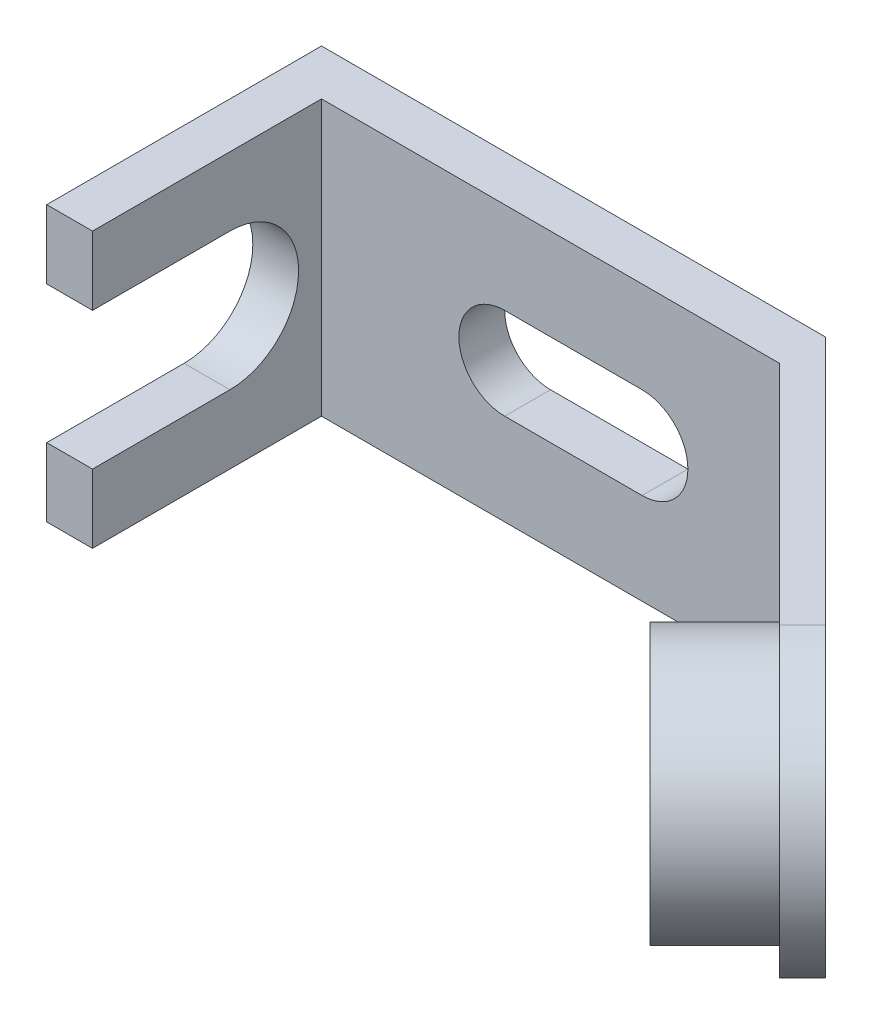
ISO-10303-21;
HEADER;
FILE_DESCRIPTION(('STEP AP214'),'2;1');
FILE_NAME('part.step','',(''),(''),'','','');
FILE_SCHEMA(('AUTOMOTIVE_DESIGN { 1 0 10303 214 1 1 1 1 }'));
ENDSEC;
DATA;
#1=APPLICATION_CONTEXT('core data for automotive mechanical design processes');
#2=APPLICATION_PROTOCOL_DEFINITION('international standard','automotive_design',2000,#1);
#3=PRODUCT_CONTEXT('',#1,'mechanical');
#4=PRODUCT('Part','Part','',(#3));
#5=PRODUCT_RELATED_PRODUCT_CATEGORY('part','',(#4));
#6=PRODUCT_DEFINITION_FORMATION('','',#4);
#7=PRODUCT_DEFINITION_CONTEXT('part definition',#1,'design');
#8=PRODUCT_DEFINITION('design','',#6,#7);
#9=PRODUCT_DEFINITION_SHAPE('','',#8);
#10=(LENGTH_UNIT() NAMED_UNIT(*) SI_UNIT(.MILLI.,.METRE.));
#11=(NAMED_UNIT(*) PLANE_ANGLE_UNIT() SI_UNIT($,.RADIAN.));
#12=(NAMED_UNIT(*) SI_UNIT($,.STERADIAN.) SOLID_ANGLE_UNIT());
#13=UNCERTAINTY_MEASURE_WITH_UNIT(LENGTH_MEASURE(1.E-05),#10,'distance_accuracy_value','');
#14=(GEOMETRIC_REPRESENTATION_CONTEXT(3) GLOBAL_UNCERTAINTY_ASSIGNED_CONTEXT((#13)) GLOBAL_UNIT_ASSIGNED_CONTEXT((#10,
#11,#12)) REPRESENTATION_CONTEXT('',''));
#15=CARTESIAN_POINT('',(0.,0.,0.));
#16=DIRECTION('',(0.,0.,1.));
#17=DIRECTION('',(1.,0.,0.));
#18=AXIS2_PLACEMENT_3D('',#15,#16,#17);
#19=CARTESIAN_POINT('',(-50.,-30.,10.));
#20=DIRECTION('',(0.,1.,0.));
#21=DIRECTION('',(0.,0.,1.));
#22=AXIS2_PLACEMENT_3D('',#19,#20,#21);
#23=PLANE('',#22);
#24=DIRECTION('',(-0.707106781186549,0.,0.707106781186546));
#25=VECTOR('',#24,1.);
#26=CARTESIAN_POINT('',(113.639610306789,-30.,45.3553390593275));
#27=LINE('',#26,#25);
#28=CARTESIAN_POINT('',(104.497474683058,-30.,54.4974746830584));
#29=VERTEX_POINT('',#28);
#30=CARTESIAN_POINT('',(99.4974746830583,-30.,59.4974746830584));
#31=VERTEX_POINT('',#30);
#32=EDGE_CURVE('E49',#29,#31,#27,.T.);
#33=ORIENTED_EDGE('',*,*,#32,.T.);
#34=DIRECTION('',(-0.707106781186546,0.,-0.707106781186549));
#35=VECTOR('',#34,1.);
#36=CARTESIAN_POINT('',(50.,-30.,10.));
#37=LINE('',#36,#35);
#38=CARTESIAN_POINT('',(50.,-30.,10.));
#39=VERTEX_POINT('',#38);
#40=EDGE_CURVE('E159',#31,#39,#37,.T.);
#41=ORIENTED_EDGE('',*,*,#40,.T.);
#42=DIRECTION('',(1.,0.,0.));
#43=VECTOR('',#42,1.);
#44=CARTESIAN_POINT('',(-50.,-30.,10.));
#45=LINE('',#44,#43);
#46=CARTESIAN_POINT('',(-50.,-30.,10.));
#47=VERTEX_POINT('',#46);
#48=EDGE_CURVE('E43',#47,#39,#45,.T.);
#49=ORIENTED_EDGE('',*,*,#48,.F.);
#50=DIRECTION('',(0.,0.,1.));
#51=VECTOR('',#50,1.);
#52=CARTESIAN_POINT('',(-50.,-30.,0.));
#53=LINE('',#52,#51);
#54=CARTESIAN_POINT('',(-50.,-30.,60.));
#55=VERTEX_POINT('',#54);
#56=EDGE_CURVE('E167',#47,#55,#53,.T.);
#57=ORIENTED_EDGE('',*,*,#56,.T.);
#58=DIRECTION('',(1.,0.,0.));
#59=VECTOR('',#58,1.);
#60=CARTESIAN_POINT('',(-60.,-30.,60.));
#61=LINE('',#60,#59);
#62=CARTESIAN_POINT('',(-60.,-30.,60.));
#63=VERTEX_POINT('',#62);
#64=EDGE_CURVE('E224',#63,#55,#61,.T.);
#65=ORIENTED_EDGE('',*,*,#64,.F.);
#66=DIRECTION('',(0.,0.,1.));
#67=VECTOR('',#66,1.);
#68=CARTESIAN_POINT('',(-60.,-30.,0.));
#69=LINE('',#68,#67);
#70=CARTESIAN_POINT('',(-60.,-30.,0.));
#71=VERTEX_POINT('',#70);
#72=EDGE_CURVE('E181',#71,#63,#69,.T.);
#73=ORIENTED_EDGE('',*,*,#72,.F.);
#74=DIRECTION('',(1.,0.,0.));
#75=VECTOR('',#74,1.);
#76=CARTESIAN_POINT('',(-50.,-30.,0.));
#77=LINE('',#76,#75);
#78=CARTESIAN_POINT('',(50.,-30.,0.));
#79=VERTEX_POINT('',#78);
#80=EDGE_CURVE('E259',#71,#79,#77,.T.);
#81=ORIENTED_EDGE('',*,*,#80,.T.);
#82=DIRECTION('',(0.707106781186546,0.,0.707106781186549));
#83=VECTOR('',#82,1.);
#84=CARTESIAN_POINT('',(50.,-30.,0.));
#85=LINE('',#84,#83);
#86=EDGE_CURVE('E169',#79,#29,#85,.T.);
#87=ORIENTED_EDGE('',*,*,#86,.T.);
#88=EDGE_LOOP('',(#33,#41,#49,#57,#65,#73,#81,#87));
#89=FACE_BOUND('',#88,.T.);
#90=ADVANCED_FACE('F34',(#89),#23,.F.);
#91=CARTESIAN_POINT('',(50.,146.726175299287,10.));
#92=DIRECTION('',(-0.707106781186549,0.,0.707106781186546));
#93=DIRECTION('',(0.707106781186546,0.,0.707106781186549));
#94=AXIS2_PLACEMENT_3D('',#91,#92,#93);
#95=PLANE('',#94);
#96=CARTESIAN_POINT('',(99.4974746830583,0.,59.4974746830584));
#97=DIRECTION('',(-0.707106781186549,0.,0.707106781186546));
#98=DIRECTION('',(0.707106781186546,0.,0.707106781186549));
#99=AXIS2_PLACEMENT_3D('',#96,#97,#98);
#100=CIRCLE('',#99,25.);
#101=CARTESIAN_POINT('',(117.175144212722,0.,77.1751442127222));
#102=VERTEX_POINT('',#101);
#103=EDGE_CURVE('E173',#102,#102,#100,.T.);
#104=ORIENTED_EDGE('',*,*,#103,.F.);
#105=EDGE_LOOP('',(#104));
#106=FACE_BOUND('',#105,.T.);
#107=CARTESIAN_POINT('',(99.4974746830583,0.,59.4974746830584));
#108=DIRECTION('',(-0.707106781186549,0.,0.707106781186546));
#109=DIRECTION('',(0.707106781186546,0.,0.707106781186549));
#110=AXIS2_PLACEMENT_3D('',#107,#108,#109);
#111=CIRCLE('',#110,30.);
#112=CARTESIAN_POINT('',(99.4974746830583,30.,59.4974746830584));
#113=VERTEX_POINT('',#112);
#114=EDGE_CURVE('E148',#113,#31,#111,.F.);
#115=ORIENTED_EDGE('',*,*,#114,.F.);
#116=DIRECTION('',(0.707106781186546,0.,0.707106781186549));
#117=VECTOR('',#116,1.);
#118=CARTESIAN_POINT('',(50.,30.,10.));
#119=LINE('',#118,#117);
#120=CARTESIAN_POINT('',(50.,30.,10.));
#121=VERTEX_POINT('',#120);
#122=EDGE_CURVE('E158',#121,#113,#119,.T.);
#123=ORIENTED_EDGE('',*,*,#122,.F.);
#124=DIRECTION('',(0.,1.,0.));
#125=VECTOR('',#124,1.);
#126=CARTESIAN_POINT('',(50.,-30.,10.));
#127=LINE('',#126,#125);
#128=EDGE_CURVE('E257',#39,#121,#127,.T.);
#129=ORIENTED_EDGE('',*,*,#128,.F.);
#130=ORIENTED_EDGE('',*,*,#40,.F.);
#131=EDGE_LOOP('',(#115,#123,#129,#130));
#132=FACE_BOUND('',#131,.T.);
#133=ADVANCED_FACE('F156',(#106,#132),#95,.T.);
#134=CARTESIAN_POINT('',(50.,146.726175299287,0.));
#135=DIRECTION('',(0.707106781186549,0.,-0.707106781186546));
#136=DIRECTION('',(-0.707106781186546,0.,-0.707106781186549));
#137=AXIS2_PLACEMENT_3D('',#134,#135,#136);
#138=PLANE('',#137);
#139=CARTESIAN_POINT('',(104.497474683058,0.,54.4974746830584));
#140=DIRECTION('',(0.707106781186549,0.,-0.707106781186546));
#141=DIRECTION('',(-0.707106781186546,0.,-0.707106781186549));
#142=AXIS2_PLACEMENT_3D('',#139,#140,#141);
#143=CIRCLE('',#142,15.);
#144=CARTESIAN_POINT('',(93.89087296526,0.,43.8908729652602));
#145=VERTEX_POINT('',#144);
#146=EDGE_CURVE('E38',#145,#145,#143,.T.);
#147=ORIENTED_EDGE('',*,*,#146,.F.);
#148=EDGE_LOOP('',(#147));
#149=FACE_BOUND('',#148,.T.);
#150=CARTESIAN_POINT('',(104.497474683058,0.,54.4974746830584));
#151=DIRECTION('',(0.707106781186549,0.,-0.707106781186546));
#152=DIRECTION('',(-0.707106781186546,0.,-0.707106781186549));
#153=AXIS2_PLACEMENT_3D('',#150,#151,#152);
#154=CIRCLE('',#153,30.);
#155=CARTESIAN_POINT('',(104.497474683058,30.,54.4974746830585));
#156=VERTEX_POINT('',#155);
#157=EDGE_CURVE('E11',#29,#156,#154,.F.);
#158=ORIENTED_EDGE('',*,*,#157,.F.);
#159=ORIENTED_EDGE('',*,*,#86,.F.);
#160=DIRECTION('',(0.,1.,0.));
#161=VECTOR('',#160,1.);
#162=CARTESIAN_POINT('',(50.,-30.,0.));
#163=LINE('',#162,#161);
#164=CARTESIAN_POINT('',(50.,30.,0.));
#165=VERTEX_POINT('',#164);
#166=EDGE_CURVE('E256',#79,#165,#163,.T.);
#167=ORIENTED_EDGE('',*,*,#166,.T.);
#168=DIRECTION('',(-0.707106781186546,0.,-0.707106781186549));
#169=VECTOR('',#168,1.);
#170=CARTESIAN_POINT('',(50.,30.,0.));
#171=LINE('',#170,#169);
#172=EDGE_CURVE('E165',#156,#165,#171,.T.);
#173=ORIENTED_EDGE('',*,*,#172,.F.);
#174=EDGE_LOOP('',(#158,#159,#167,#173));
#175=FACE_BOUND('',#174,.T.);
#176=ADVANCED_FACE('F278',(#149,#175),#138,.T.);
#177=CARTESIAN_POINT('',(0.,0.,10.));
#178=DIRECTION('',(0.,0.,-1.));
#179=DIRECTION('',(-1.,0.,0.));
#180=AXIS2_PLACEMENT_3D('',#177,#178,#179);
#181=PLANE('',#180);
#182=ORIENTED_EDGE('',*,*,#128,.T.);
#183=DIRECTION('',(-1.,0.,0.));
#184=VECTOR('',#183,1.);
#185=CARTESIAN_POINT('',(-50.,30.,10.));
#186=LINE('',#185,#184);
#187=CARTESIAN_POINT('',(-50.,30.,10.));
#188=VERTEX_POINT('',#187);
#189=EDGE_CURVE('E163',#121,#188,#186,.T.);
#190=ORIENTED_EDGE('',*,*,#189,.T.);
#191=DIRECTION('',(0.,-1.,0.));
#192=VECTOR('',#191,1.);
#193=CARTESIAN_POINT('',(-50.,-30.,10.));
#194=LINE('',#193,#192);
#195=EDGE_CURVE('E261',#188,#47,#194,.T.);
#196=ORIENTED_EDGE('',*,*,#195,.T.);
#197=ORIENTED_EDGE('',*,*,#48,.T.);
#198=EDGE_LOOP('',(#182,#190,#196,#197));
#199=FACE_BOUND('',#198,.T.);
#200=CARTESIAN_POINT('',(-9.99999999999999,0.,10.));
#201=DIRECTION('',(0.,0.,1.));
#202=DIRECTION('',(1.,0.,0.));
#203=AXIS2_PLACEMENT_3D('',#200,#201,#202);
#204=CIRCLE('',#203,10.);
#205=CARTESIAN_POINT('',(-9.99999999999999,10.,10.));
#206=VERTEX_POINT('',#205);
#207=CARTESIAN_POINT('',(-9.99999999999999,-10.,10.));
#208=VERTEX_POINT('',#207);
#209=EDGE_CURVE('E228',#206,#208,#204,.T.);
#210=ORIENTED_EDGE('',*,*,#209,.F.);
#211=DIRECTION('',(-1.,0.,0.));
#212=VECTOR('',#211,1.);
#213=CARTESIAN_POINT('',(-9.99999999999999,10.,10.));
#214=LINE('',#213,#212);
#215=CARTESIAN_POINT('',(20.,10.,10.));
#216=VERTEX_POINT('',#215);
#217=EDGE_CURVE('E235',#216,#206,#214,.T.);
#218=ORIENTED_EDGE('',*,*,#217,.F.);
#219=CARTESIAN_POINT('',(20.,0.,10.));
#220=DIRECTION('',(0.,0.,1.));
#221=DIRECTION('',(1.,0.,0.));
#222=AXIS2_PLACEMENT_3D('',#219,#220,#221);
#223=CIRCLE('',#222,10.);
#224=CARTESIAN_POINT('',(20.,-10.,10.));
#225=VERTEX_POINT('',#224);
#226=EDGE_CURVE('E233',#225,#216,#223,.T.);
#227=ORIENTED_EDGE('',*,*,#226,.F.);
#228=DIRECTION('',(1.,0.,0.));
#229=VECTOR('',#228,1.);
#230=CARTESIAN_POINT('',(-9.99999999999999,-10.,10.));
#231=LINE('',#230,#229);
#232=EDGE_CURVE('E230',#208,#225,#231,.T.);
#233=ORIENTED_EDGE('',*,*,#232,.F.);
#234=EDGE_LOOP('',(#210,#218,#227,#233));
#235=FACE_BOUND('',#234,.T.);
#236=ADVANCED_FACE('F296',(#199,#235),#181,.F.);
#237=CARTESIAN_POINT('',(0.,0.,0.));
#238=DIRECTION('',(0.,0.,-1.));
#239=DIRECTION('',(-1.,0.,0.));
#240=AXIS2_PLACEMENT_3D('',#237,#238,#239);
#241=PLANE('',#240);
#242=ORIENTED_EDGE('',*,*,#166,.F.);
#243=ORIENTED_EDGE('',*,*,#80,.F.);
#244=DIRECTION('',(0.,-1.,0.));
#245=VECTOR('',#244,1.);
#246=CARTESIAN_POINT('',(-60.,30.,0.));
#247=LINE('',#246,#245);
#248=CARTESIAN_POINT('',(-60.,30.,0.));
#249=VERTEX_POINT('',#248);
#250=EDGE_CURVE('E178',#249,#71,#247,.T.);
#251=ORIENTED_EDGE('',*,*,#250,.F.);
#252=DIRECTION('',(-1.,0.,0.));
#253=VECTOR('',#252,1.);
#254=CARTESIAN_POINT('',(-50.,30.,0.));
#255=LINE('',#254,#253);
#256=EDGE_CURVE('E268',#165,#249,#255,.T.);
#257=ORIENTED_EDGE('',*,*,#256,.F.);
#258=EDGE_LOOP('',(#242,#243,#251,#257));
#259=FACE_BOUND('',#258,.T.);
#260=DIRECTION('',(-1.,0.,0.));
#261=VECTOR('',#260,1.);
#262=CARTESIAN_POINT('',(-9.99999999999999,10.,0.));
#263=LINE('',#262,#261);
#264=CARTESIAN_POINT('',(20.,10.,0.));
#265=VERTEX_POINT('',#264);
#266=CARTESIAN_POINT('',(-9.99999999999999,10.,0.));
#267=VERTEX_POINT('',#266);
#268=EDGE_CURVE('E231',#265,#267,#263,.T.);
#269=ORIENTED_EDGE('',*,*,#268,.T.);
#270=CARTESIAN_POINT('',(-9.99999999999999,0.,0.));
#271=DIRECTION('',(0.,0.,1.));
#272=DIRECTION('',(1.,0.,0.));
#273=AXIS2_PLACEMENT_3D('',#270,#271,#272);
#274=CIRCLE('',#273,10.);
#275=CARTESIAN_POINT('',(-9.99999999999999,-10.,0.));
#276=VERTEX_POINT('',#275);
#277=EDGE_CURVE('E227',#267,#276,#274,.T.);
#278=ORIENTED_EDGE('',*,*,#277,.T.);
#279=DIRECTION('',(1.,0.,0.));
#280=VECTOR('',#279,1.);
#281=CARTESIAN_POINT('',(-9.99999999999999,-10.,0.));
#282=LINE('',#281,#280);
#283=CARTESIAN_POINT('',(20.,-10.,0.));
#284=VERTEX_POINT('',#283);
#285=EDGE_CURVE('E240',#276,#284,#282,.T.);
#286=ORIENTED_EDGE('',*,*,#285,.T.);
#287=CARTESIAN_POINT('',(20.,0.,0.));
#288=DIRECTION('',(0.,0.,1.));
#289=DIRECTION('',(1.,0.,0.));
#290=AXIS2_PLACEMENT_3D('',#287,#288,#289);
#291=CIRCLE('',#290,10.);
#292=EDGE_CURVE('E243',#284,#265,#291,.T.);
#293=ORIENTED_EDGE('',*,*,#292,.T.);
#294=EDGE_LOOP('',(#269,#278,#286,#293));
#295=FACE_BOUND('',#294,.T.);
#296=ADVANCED_FACE('F281',(#259,#295),#241,.T.);
#297=CARTESIAN_POINT('',(-50.,30.,10.));
#298=DIRECTION('',(0.,-1.,0.));
#299=DIRECTION('',(0.,0.,-1.));
#300=AXIS2_PLACEMENT_3D('',#297,#298,#299);
#301=PLANE('',#300);
#302=ORIENTED_EDGE('',*,*,#122,.T.);
#303=DIRECTION('',(-0.707106781186549,0.,0.707106781186546));
#304=VECTOR('',#303,1.);
#305=CARTESIAN_POINT('',(113.639610306789,30.,45.3553390593275));
#306=LINE('',#305,#304);
#307=EDGE_CURVE('E145',#156,#113,#306,.T.);
#308=ORIENTED_EDGE('',*,*,#307,.F.);
#309=ORIENTED_EDGE('',*,*,#172,.T.);
#310=ORIENTED_EDGE('',*,*,#256,.T.);
#311=DIRECTION('',(0.,0.,-1.));
#312=VECTOR('',#311,1.);
#313=CARTESIAN_POINT('',(-60.,30.,0.));
#314=LINE('',#313,#312);
#315=CARTESIAN_POINT('',(-60.,30.,60.));
#316=VERTEX_POINT('',#315);
#317=EDGE_CURVE('E194',#316,#249,#314,.T.);
#318=ORIENTED_EDGE('',*,*,#317,.F.);
#319=DIRECTION('',(1.,0.,0.));
#320=VECTOR('',#319,1.);
#321=CARTESIAN_POINT('',(-60.,30.,60.));
#322=LINE('',#321,#320);
#323=CARTESIAN_POINT('',(-50.,30.,60.));
#324=VERTEX_POINT('',#323);
#325=EDGE_CURVE('E197',#316,#324,#322,.T.);
#326=ORIENTED_EDGE('',*,*,#325,.T.);
#327=DIRECTION('',(0.,0.,-1.));
#328=VECTOR('',#327,1.);
#329=CARTESIAN_POINT('',(-50.,30.,0.));
#330=LINE('',#329,#328);
#331=EDGE_CURVE('E182',#324,#188,#330,.T.);
#332=ORIENTED_EDGE('',*,*,#331,.T.);
#333=ORIENTED_EDGE('',*,*,#189,.F.);
#334=EDGE_LOOP('',(#302,#308,#309,#310,#318,#326,#332,#333));
#335=FACE_BOUND('',#334,.T.);
#336=ADVANCED_FACE('F36',(#335),#301,.F.);
#337=CARTESIAN_POINT('',(-9.99999999999999,0.,10.));
#338=DIRECTION('',(0.,0.,-1.));
#339=DIRECTION('',(-1.,0.,0.));
#340=AXIS2_PLACEMENT_3D('',#337,#338,#339);
#341=CYLINDRICAL_SURFACE('',#340,10.);
#342=ORIENTED_EDGE('',*,*,#277,.F.);
#343=DIRECTION('',(0.,0.,-1.));
#344=VECTOR('',#343,1.);
#345=CARTESIAN_POINT('',(-9.99999999999999,10.,10.));
#346=LINE('',#345,#344);
#347=EDGE_CURVE('E237',#206,#267,#346,.T.);
#348=ORIENTED_EDGE('',*,*,#347,.F.);
#349=ORIENTED_EDGE('',*,*,#209,.T.);
#350=DIRECTION('',(0.,0.,-1.));
#351=VECTOR('',#350,1.);
#352=CARTESIAN_POINT('',(-9.99999999999999,-10.,10.));
#353=LINE('',#352,#351);
#354=EDGE_CURVE('E253',#208,#276,#353,.T.);
#355=ORIENTED_EDGE('',*,*,#354,.T.);
#356=EDGE_LOOP('',(#342,#348,#349,#355));
#357=FACE_BOUND('',#356,.T.);
#358=ADVANCED_FACE('F358',(#357),#341,.F.);
#359=CARTESIAN_POINT('',(-9.99999999999999,-10.,10.));
#360=DIRECTION('',(0.,1.,0.));
#361=DIRECTION('',(0.,0.,1.));
#362=AXIS2_PLACEMENT_3D('',#359,#360,#361);
#363=PLANE('',#362);
#364=ORIENTED_EDGE('',*,*,#285,.F.);
#365=ORIENTED_EDGE('',*,*,#354,.F.);
#366=ORIENTED_EDGE('',*,*,#232,.T.);
#367=DIRECTION('',(0.,0.,-1.));
#368=VECTOR('',#367,1.);
#369=CARTESIAN_POINT('',(20.,-10.,10.));
#370=LINE('',#369,#368);
#371=EDGE_CURVE('E251',#225,#284,#370,.T.);
#372=ORIENTED_EDGE('',*,*,#371,.T.);
#373=EDGE_LOOP('',(#364,#365,#366,#372));
#374=FACE_BOUND('',#373,.T.);
#375=ADVANCED_FACE('F354',(#374),#363,.T.);
#376=CARTESIAN_POINT('',(20.,0.,10.));
#377=DIRECTION('',(0.,0.,-1.));
#378=DIRECTION('',(-1.,0.,0.));
#379=AXIS2_PLACEMENT_3D('',#376,#377,#378);
#380=CYLINDRICAL_SURFACE('',#379,10.);
#381=ORIENTED_EDGE('',*,*,#292,.F.);
#382=ORIENTED_EDGE('',*,*,#371,.F.);
#383=ORIENTED_EDGE('',*,*,#226,.T.);
#384=DIRECTION('',(0.,0.,-1.));
#385=VECTOR('',#384,1.);
#386=CARTESIAN_POINT('',(20.,10.,10.));
#387=LINE('',#386,#385);
#388=EDGE_CURVE('E57',#216,#265,#387,.T.);
#389=ORIENTED_EDGE('',*,*,#388,.T.);
#390=EDGE_LOOP('',(#381,#382,#383,#389));
#391=FACE_BOUND('',#390,.T.);
#392=ADVANCED_FACE('F351',(#391),#380,.F.);
#393=CARTESIAN_POINT('',(-9.99999999999999,10.,10.));
#394=DIRECTION('',(0.,-1.,0.));
#395=DIRECTION('',(0.,0.,-1.));
#396=AXIS2_PLACEMENT_3D('',#393,#394,#395);
#397=PLANE('',#396);
#398=ORIENTED_EDGE('',*,*,#268,.F.);
#399=ORIENTED_EDGE('',*,*,#388,.F.);
#400=ORIENTED_EDGE('',*,*,#217,.T.);
#401=ORIENTED_EDGE('',*,*,#347,.T.);
#402=EDGE_LOOP('',(#398,#399,#400,#401));
#403=FACE_BOUND('',#402,.T.);
#404=ADVANCED_FACE('F347',(#403),#397,.T.);
#405=CARTESIAN_POINT('',(-60.,-30.,60.));
#406=DIRECTION('',(0.,0.,-1.));
#407=DIRECTION('',(0.,1.,0.));
#408=AXIS2_PLACEMENT_3D('',#405,#406,#407);
#409=PLANE('',#408);
#410=DIRECTION('',(0.,1.,0.));
#411=VECTOR('',#410,1.);
#412=CARTESIAN_POINT('',(-50.,-30.,60.));
#413=LINE('',#412,#411);
#414=CARTESIAN_POINT('',(-50.,-15.,60.));
#415=VERTEX_POINT('',#414);
#416=EDGE_CURVE('E199',#55,#415,#413,.T.);
#417=ORIENTED_EDGE('',*,*,#416,.T.);
#418=DIRECTION('',(1.,0.,0.));
#419=VECTOR('',#418,1.);
#420=CARTESIAN_POINT('',(-60.,-15.,60.));
#421=LINE('',#420,#419);
#422=CARTESIAN_POINT('',(-60.,-15.,60.));
#423=VERTEX_POINT('',#422);
#424=EDGE_CURVE('E221',#423,#415,#421,.T.);
#425=ORIENTED_EDGE('',*,*,#424,.F.);
#426=DIRECTION('',(0.,1.,0.));
#427=VECTOR('',#426,1.);
#428=CARTESIAN_POINT('',(-60.,-30.,60.));
#429=LINE('',#428,#427);
#430=EDGE_CURVE('E184',#63,#423,#429,.T.);
#431=ORIENTED_EDGE('',*,*,#430,.F.);
#432=ORIENTED_EDGE('',*,*,#64,.T.);
#433=EDGE_LOOP('',(#417,#425,#431,#432));
#434=FACE_BOUND('',#433,.T.);
#435=ADVANCED_FACE('F343',(#434),#409,.F.);
#436=CARTESIAN_POINT('',(-60.,-15.,60.));
#437=DIRECTION('',(0.,-1.,0.));
#438=DIRECTION('',(0.,0.,-1.));
#439=AXIS2_PLACEMENT_3D('',#436,#437,#438);
#440=PLANE('',#439);
#441=DIRECTION('',(0.,0.,-1.));
#442=VECTOR('',#441,1.);
#443=CARTESIAN_POINT('',(-50.,-15.,60.));
#444=LINE('',#443,#442);
#445=CARTESIAN_POINT('',(-50.,-15.,30.));
#446=VERTEX_POINT('',#445);
#447=EDGE_CURVE('E201',#415,#446,#444,.T.);
#448=ORIENTED_EDGE('',*,*,#447,.T.);
#449=DIRECTION('',(1.,0.,0.));
#450=VECTOR('',#449,1.);
#451=CARTESIAN_POINT('',(-60.,-15.,30.));
#452=LINE('',#451,#450);
#453=CARTESIAN_POINT('',(-60.,-15.,30.));
#454=VERTEX_POINT('',#453);
#455=EDGE_CURVE('E218',#454,#446,#452,.T.);
#456=ORIENTED_EDGE('',*,*,#455,.F.);
#457=DIRECTION('',(0.,0.,-1.));
#458=VECTOR('',#457,1.);
#459=CARTESIAN_POINT('',(-60.,-15.,60.));
#460=LINE('',#459,#458);
#461=EDGE_CURVE('E186',#423,#454,#460,.T.);
#462=ORIENTED_EDGE('',*,*,#461,.F.);
#463=ORIENTED_EDGE('',*,*,#424,.T.);
#464=EDGE_LOOP('',(#448,#456,#462,#463));
#465=FACE_BOUND('',#464,.T.);
#466=ADVANCED_FACE('F339',(#465),#440,.F.);
#467=CARTESIAN_POINT('',(-60.,0.,30.));
#468=DIRECTION('',(1.,0.,0.));
#469=DIRECTION('',(0.,0.,-1.));
#470=AXIS2_PLACEMENT_3D('',#467,#468,#469);
#471=CYLINDRICAL_SURFACE('',#470,15.);
#472=CARTESIAN_POINT('',(-50.,0.,30.));
#473=DIRECTION('',(1.,0.,0.));
#474=DIRECTION('',(0.,0.,1.));
#475=AXIS2_PLACEMENT_3D('',#472,#473,#474);
#476=CIRCLE('',#475,15.);
#477=CARTESIAN_POINT('',(-50.,15.,30.));
#478=VERTEX_POINT('',#477);
#479=EDGE_CURVE('E203',#446,#478,#476,.T.);
#480=ORIENTED_EDGE('',*,*,#479,.T.);
#481=DIRECTION('',(1.,0.,0.));
#482=VECTOR('',#481,1.);
#483=CARTESIAN_POINT('',(-60.,15.,30.));
#484=LINE('',#483,#482);
#485=CARTESIAN_POINT('',(-60.,15.,30.));
#486=VERTEX_POINT('',#485);
#487=EDGE_CURVE('E215',#486,#478,#484,.T.);
#488=ORIENTED_EDGE('',*,*,#487,.F.);
#489=CARTESIAN_POINT('',(-60.,0.,30.));
#490=DIRECTION('',(1.,0.,0.));
#491=DIRECTION('',(0.,0.,1.));
#492=AXIS2_PLACEMENT_3D('',#489,#490,#491);
#493=CIRCLE('',#492,15.);
#494=EDGE_CURVE('E188',#454,#486,#493,.T.);
#495=ORIENTED_EDGE('',*,*,#494,.F.);
#496=ORIENTED_EDGE('',*,*,#455,.T.);
#497=EDGE_LOOP('',(#480,#488,#495,#496));
#498=FACE_BOUND('',#497,.T.);
#499=ADVANCED_FACE('F335',(#498),#471,.F.);
#500=CARTESIAN_POINT('',(-60.,15.,60.));
#501=DIRECTION('',(0.,1.,0.));
#502=DIRECTION('',(0.,0.,1.));
#503=AXIS2_PLACEMENT_3D('',#500,#501,#502);
#504=PLANE('',#503);
#505=DIRECTION('',(0.,0.,1.));
#506=VECTOR('',#505,1.);
#507=CARTESIAN_POINT('',(-50.,15.,60.));
#508=LINE('',#507,#506);
#509=CARTESIAN_POINT('',(-50.,15.,60.));
#510=VERTEX_POINT('',#509);
#511=EDGE_CURVE('E205',#478,#510,#508,.T.);
#512=ORIENTED_EDGE('',*,*,#511,.T.);
#513=DIRECTION('',(1.,0.,0.));
#514=VECTOR('',#513,1.);
#515=CARTESIAN_POINT('',(-60.,15.,60.));
#516=LINE('',#515,#514);
#517=CARTESIAN_POINT('',(-60.,15.,60.));
#518=VERTEX_POINT('',#517);
#519=EDGE_CURVE('E212',#518,#510,#516,.T.);
#520=ORIENTED_EDGE('',*,*,#519,.F.);
#521=DIRECTION('',(0.,0.,1.));
#522=VECTOR('',#521,1.);
#523=CARTESIAN_POINT('',(-60.,15.,60.));
#524=LINE('',#523,#522);
#525=EDGE_CURVE('E190',#486,#518,#524,.T.);
#526=ORIENTED_EDGE('',*,*,#525,.F.);
#527=ORIENTED_EDGE('',*,*,#487,.T.);
#528=EDGE_LOOP('',(#512,#520,#526,#527));
#529=FACE_BOUND('',#528,.T.);
#530=ADVANCED_FACE('F332',(#529),#504,.F.);
#531=CARTESIAN_POINT('',(-60.,30.,60.));
#532=DIRECTION('',(0.,0.,-1.));
#533=DIRECTION('',(-1.,0.,0.));
#534=AXIS2_PLACEMENT_3D('',#531,#532,#533);
#535=PLANE('',#534);
#536=DIRECTION('',(0.,1.,0.));
#537=VECTOR('',#536,1.);
#538=CARTESIAN_POINT('',(-50.,30.,60.));
#539=LINE('',#538,#537);
#540=EDGE_CURVE('E207',#510,#324,#539,.T.);
#541=ORIENTED_EDGE('',*,*,#540,.T.);
#542=ORIENTED_EDGE('',*,*,#325,.F.);
#543=DIRECTION('',(0.,1.,0.));
#544=VECTOR('',#543,1.);
#545=CARTESIAN_POINT('',(-60.,30.,60.));
#546=LINE('',#545,#544);
#547=EDGE_CURVE('E192',#518,#316,#546,.T.);
#548=ORIENTED_EDGE('',*,*,#547,.F.);
#549=ORIENTED_EDGE('',*,*,#519,.T.);
#550=EDGE_LOOP('',(#541,#542,#548,#549));
#551=FACE_BOUND('',#550,.T.);
#552=ADVANCED_FACE('F327',(#551),#535,.F.);
#553=CARTESIAN_POINT('',(-60.,0.,30.));
#554=DIRECTION('',(-1.,0.,0.));
#555=DIRECTION('',(0.,0.,1.));
#556=AXIS2_PLACEMENT_3D('',#553,#554,#555);
#557=PLANE('',#556);
#558=ORIENTED_EDGE('',*,*,#250,.T.);
#559=ORIENTED_EDGE('',*,*,#72,.T.);
#560=ORIENTED_EDGE('',*,*,#430,.T.);
#561=ORIENTED_EDGE('',*,*,#461,.T.);
#562=ORIENTED_EDGE('',*,*,#494,.T.);
#563=ORIENTED_EDGE('',*,*,#525,.T.);
#564=ORIENTED_EDGE('',*,*,#547,.T.);
#565=ORIENTED_EDGE('',*,*,#317,.T.);
#566=EDGE_LOOP('',(#558,#559,#560,#561,#562,#563,#564,#565));
#567=FACE_BOUND('',#566,.T.);
#568=ADVANCED_FACE('F284',(#567),#557,.T.);
#569=CARTESIAN_POINT('',(-50.,0.,30.));
#570=DIRECTION('',(-1.,0.,0.));
#571=DIRECTION('',(0.,0.,1.));
#572=AXIS2_PLACEMENT_3D('',#569,#570,#571);
#573=PLANE('',#572);
#574=ORIENTED_EDGE('',*,*,#195,.F.);
#575=ORIENTED_EDGE('',*,*,#331,.F.);
#576=ORIENTED_EDGE('',*,*,#540,.F.);
#577=ORIENTED_EDGE('',*,*,#511,.F.);
#578=ORIENTED_EDGE('',*,*,#479,.F.);
#579=ORIENTED_EDGE('',*,*,#447,.F.);
#580=ORIENTED_EDGE('',*,*,#416,.F.);
#581=ORIENTED_EDGE('',*,*,#56,.F.);
#582=EDGE_LOOP('',(#574,#575,#576,#577,#578,#579,#580,#581));
#583=FACE_BOUND('',#582,.T.);
#584=ADVANCED_FACE('F291',(#583),#573,.F.);
#585=CARTESIAN_POINT('',(85.3553390593273,0.,73.6396103067894));
#586=DIRECTION('',(0.707106781186549,0.,-0.707106781186546));
#587=DIRECTION('',(-0.707106781186546,0.,-0.707106781186549));
#588=AXIS2_PLACEMENT_3D('',#585,#586,#587);
#589=CYLINDRICAL_SURFACE('',#588,15.);
#590=CARTESIAN_POINT('',(85.3553390593273,0.,73.6396103067894));
#591=DIRECTION('',(-0.707106781186549,0.,0.707106781186546));
#592=DIRECTION('',(0.707106781186546,0.,0.707106781186549));
#593=AXIS2_PLACEMENT_3D('',#590,#591,#592);
#594=CIRCLE('',#593,15.);
#595=CARTESIAN_POINT('',(95.9619407771255,0.,84.2462120245876));
#596=VERTEX_POINT('',#595);
#597=EDGE_CURVE('E300',#596,#596,#594,.T.);
#598=ORIENTED_EDGE('',*,*,#597,.T.);
#599=EDGE_LOOP('',(#598));
#600=FACE_BOUND('',#599,.T.);
#601=ORIENTED_EDGE('',*,*,#146,.T.);
#602=EDGE_LOOP('',(#601));
#603=FACE_BOUND('',#602,.T.);
#604=ADVANCED_FACE('F311',(#600,#603),#589,.F.);
#605=CARTESIAN_POINT('',(85.3553390593273,0.,73.6396103067894));
#606=DIRECTION('',(0.707106781186549,0.,-0.707106781186546));
#607=DIRECTION('',(-0.707106781186546,0.,-0.707106781186549));
#608=AXIS2_PLACEMENT_3D('',#605,#606,#607);
#609=CYLINDRICAL_SURFACE('',#608,25.);
#610=CARTESIAN_POINT('',(85.3553390593273,0.,73.6396103067894));
#611=DIRECTION('',(-0.707106781186549,0.,0.707106781186546));
#612=DIRECTION('',(0.707106781186546,0.,0.707106781186549));
#613=AXIS2_PLACEMENT_3D('',#610,#611,#612);
#614=CIRCLE('',#613,25.);
#615=CARTESIAN_POINT('',(103.033008588991,0.,91.3172798364531));
#616=VERTEX_POINT('',#615);
#617=EDGE_CURVE('E176',#616,#616,#614,.T.);
#618=ORIENTED_EDGE('',*,*,#617,.F.);
#619=EDGE_LOOP('',(#618));
#620=FACE_BOUND('',#619,.T.);
#621=ORIENTED_EDGE('',*,*,#103,.T.);
#622=EDGE_LOOP('',(#621));
#623=FACE_BOUND('',#622,.T.);
#624=ADVANCED_FACE('F308',(#620,#623),#609,.T.);
#625=CARTESIAN_POINT('',(5.85786437626913,0.,-5.85786437626911));
#626=DIRECTION('',(-0.707106781186549,0.,0.707106781186546));
#627=DIRECTION('',(0.707106781186546,0.,0.707106781186549));
#628=AXIS2_PLACEMENT_3D('',#625,#626,#627);
#629=PLANE('',#628);
#630=ORIENTED_EDGE('',*,*,#597,.F.);
#631=EDGE_LOOP('',(#630));
#632=FACE_BOUND('',#631,.T.);
#633=ORIENTED_EDGE('',*,*,#617,.T.);
#634=EDGE_LOOP('',(#633));
#635=FACE_BOUND('',#634,.T.);
#636=ADVANCED_FACE('F306',(#632,#635),#629,.T.);
#637=CARTESIAN_POINT('',(113.639610306789,0.,45.3553390593275));
#638=DIRECTION('',(-0.707106781186549,0.,0.707106781186546));
#639=DIRECTION('',(0.707106781186546,0.,0.707106781186549));
#640=AXIS2_PLACEMENT_3D('',#637,#638,#639);
#641=CYLINDRICAL_SURFACE('',#640,30.);
#642=ORIENTED_EDGE('',*,*,#157,.T.);
#643=ORIENTED_EDGE('',*,*,#307,.T.);
#644=ORIENTED_EDGE('',*,*,#114,.T.);
#645=ORIENTED_EDGE('',*,*,#32,.F.);
#646=EDGE_LOOP('',(#642,#643,#644,#645));
#647=FACE_BOUND('',#646,.T.);
#648=ADVANCED_FACE('F147',(#647),#641,.T.);
#649=CLOSED_SHELL('',(#90,#133,#176,#236,#296,#336,#358,#375,#392,#404,#435,#466,#499,#530,#552,
#568,#584,#604,#624,#636,#648));
#650=MANIFOLD_SOLID_BREP('B2',#649);
#651=ADVANCED_BREP_SHAPE_REPRESENTATION('',(#18,#650),#14);
#652=SHAPE_DEFINITION_REPRESENTATION(#9,#651);
ENDSEC;
END-ISO-10303-21;
